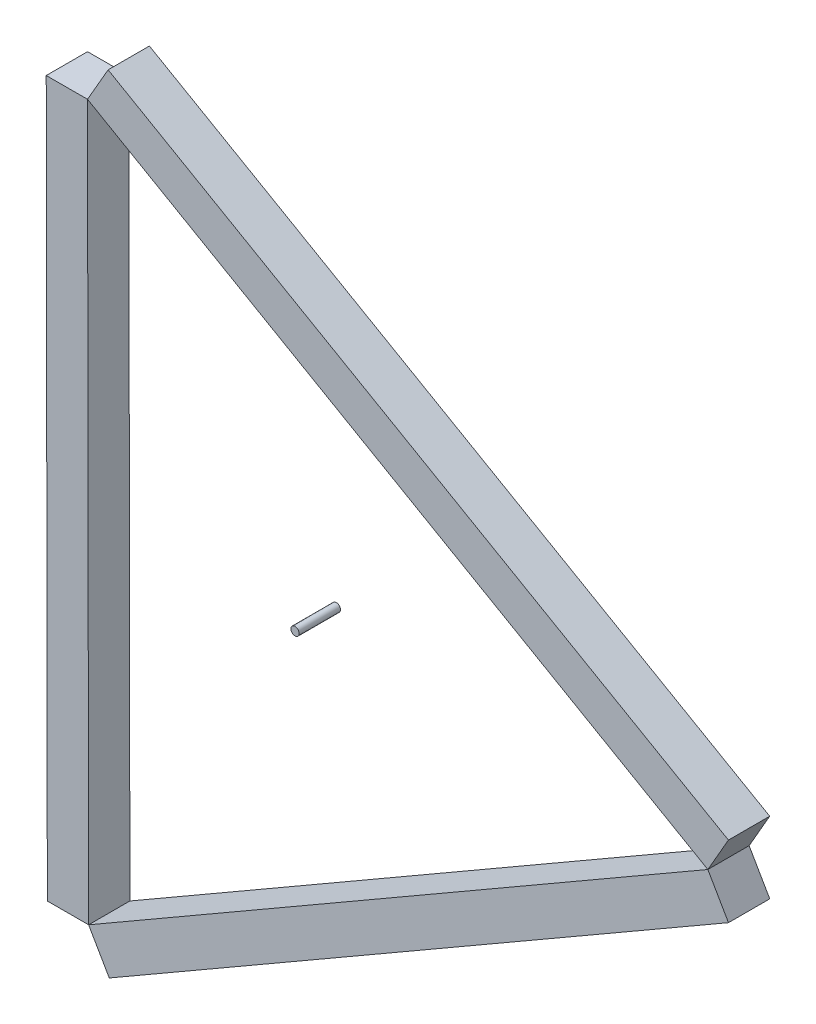
ISO-10303-21;
HEADER;
FILE_DESCRIPTION(('STEP AP214'),'2;1');
FILE_NAME('part.step','',(''),(''),'','','');
FILE_SCHEMA(('AUTOMOTIVE_DESIGN { 1 0 10303 214 1 1 1 1 }'));
ENDSEC;
DATA;
#1=APPLICATION_CONTEXT('core data for automotive mechanical design processes');
#2=APPLICATION_PROTOCOL_DEFINITION('international standard','automotive_design',2000,#1);
#3=PRODUCT_CONTEXT('',#1,'mechanical');
#4=PRODUCT('Part','Part','',(#3));
#5=PRODUCT_RELATED_PRODUCT_CATEGORY('part','',(#4));
#6=PRODUCT_DEFINITION_FORMATION('','',#4);
#7=PRODUCT_DEFINITION_CONTEXT('part definition',#1,'design');
#8=PRODUCT_DEFINITION('design','',#6,#7);
#9=PRODUCT_DEFINITION_SHAPE('','',#8);
#10=(LENGTH_UNIT() NAMED_UNIT(*) SI_UNIT(.MILLI.,.METRE.));
#11=(NAMED_UNIT(*) PLANE_ANGLE_UNIT() SI_UNIT($,.RADIAN.));
#12=(NAMED_UNIT(*) SI_UNIT($,.STERADIAN.) SOLID_ANGLE_UNIT());
#13=UNCERTAINTY_MEASURE_WITH_UNIT(LENGTH_MEASURE(1.E-05),#10,'distance_accuracy_value','');
#14=(GEOMETRIC_REPRESENTATION_CONTEXT(3) GLOBAL_UNCERTAINTY_ASSIGNED_CONTEXT((#13)) GLOBAL_UNIT_ASSIGNED_CONTEXT((#10,
#11,#12)) REPRESENTATION_CONTEXT('',''));
#15=CARTESIAN_POINT('',(0.,0.,0.));
#16=DIRECTION('',(0.,0.,1.));
#17=DIRECTION('',(1.,0.,0.));
#18=AXIS2_PLACEMENT_3D('',#15,#16,#17);
#19=CARTESIAN_POINT('',(0.,0.,50.));
#20=DIRECTION('',(0.,0.,-1.));
#21=DIRECTION('',(-1.,0.,0.));
#22=AXIS2_PLACEMENT_3D('',#19,#20,#21);
#23=CYLINDRICAL_SURFACE('',#22,10.);
#24=CARTESIAN_POINT('',(0.,0.,50.));
#25=DIRECTION('',(0.,0.,1.));
#26=DIRECTION('',(1.,0.,0.));
#27=AXIS2_PLACEMENT_3D('',#24,#25,#26);
#28=CIRCLE('',#27,10.);
#29=CARTESIAN_POINT('',(10.,0.,50.));
#30=VERTEX_POINT('',#29);
#31=EDGE_CURVE('E12',#30,#30,#28,.T.);
#32=ORIENTED_EDGE('',*,*,#31,.F.);
#33=EDGE_LOOP('',(#32));
#34=FACE_BOUND('',#33,.T.);
#35=CARTESIAN_POINT('',(0.,0.,-50.));
#36=DIRECTION('',(0.,0.,1.));
#37=DIRECTION('',(1.,0.,0.));
#38=AXIS2_PLACEMENT_3D('',#35,#36,#37);
#39=CIRCLE('',#38,10.);
#40=CARTESIAN_POINT('',(10.,0.,-50.));
#41=VERTEX_POINT('',#40);
#42=EDGE_CURVE('E101',#41,#41,#39,.T.);
#43=ORIENTED_EDGE('',*,*,#42,.T.);
#44=EDGE_LOOP('',(#43));
#45=FACE_BOUND('',#44,.T.);
#46=ADVANCED_FACE('F98',(#34,#45),#23,.T.);
#47=CARTESIAN_POINT('',(0.,0.,50.));
#48=DIRECTION('',(0.,0.,1.));
#49=DIRECTION('',(1.,0.,0.));
#50=AXIS2_PLACEMENT_3D('',#47,#48,#49);
#51=PLANE('',#50);
#52=ORIENTED_EDGE('',*,*,#31,.T.);
#53=EDGE_LOOP('',(#52));
#54=FACE_BOUND('',#53,.T.);
#55=ADVANCED_FACE('F113',(#54),#51,.T.);
#56=CARTESIAN_POINT('',(0.,0.,-50.));
#57=DIRECTION('',(0.,0.,1.));
#58=DIRECTION('',(1.,0.,0.));
#59=AXIS2_PLACEMENT_3D('',#56,#57,#58);
#60=PLANE('',#59);
#61=ORIENTED_EDGE('',*,*,#42,.F.);
#62=EDGE_LOOP('',(#61));
#63=FACE_BOUND('',#62,.T.);
#64=ADVANCED_FACE('F111',(#63),#60,.F.);
#65=CLOSED_SHELL('',(#46,#55,#64));
#66=MANIFOLD_SOLID_BREP('B2',#65);
#67=CARTESIAN_POINT('',(-501.3257187102,-0.768114748785728,50.));
#68=DIRECTION('',(-0.999998826234128,-0.00153216525410872,0.));
#69=DIRECTION('',(0.00153216525410872,-0.999998826234128,0.));
#70=AXIS2_PLACEMENT_3D('',#67,#68,#69);
#71=PLANE('',#70);
#72=DIRECTION('',(-0.00153216525410872,0.999998826234128,0.));
#73=VECTOR('',#72,1.);
#74=CARTESIAN_POINT('',(-501.3257187102,-0.768114748785728,-50.));
#75=LINE('',#74,#73);
#76=CARTESIAN_POINT('',(-499.999999999992,-866.025403784443,-50.));
#77=VERTEX_POINT('',#76);
#78=CARTESIAN_POINT('',(-502.651437420408,864.489174286872,-50.));
#79=VERTEX_POINT('',#78);
#80=EDGE_CURVE('E211',#77,#79,#75,.T.);
#81=ORIENTED_EDGE('',*,*,#80,.T.);
#82=DIRECTION('',(0.,0.,-1.));
#83=VECTOR('',#82,1.);
#84=CARTESIAN_POINT('',(-502.651437420408,864.489174286872,50.));
#85=LINE('',#84,#83);
#86=CARTESIAN_POINT('',(-502.651437420408,864.489174286872,50.));
#87=VERTEX_POINT('',#86);
#88=EDGE_CURVE('E96',#87,#79,#85,.T.);
#89=ORIENTED_EDGE('',*,*,#88,.F.);
#90=DIRECTION('',(-0.00153216525410872,0.999998826234128,0.));
#91=VECTOR('',#90,1.);
#92=CARTESIAN_POINT('',(-501.3257187102,-0.768114748785728,50.));
#93=LINE('',#92,#91);
#94=CARTESIAN_POINT('',(-499.999999999992,-866.025403784443,50.));
#95=VERTEX_POINT('',#94);
#96=EDGE_CURVE('E188',#95,#87,#93,.T.);
#97=ORIENTED_EDGE('',*,*,#96,.F.);
#98=DIRECTION('',(0.,0.,-1.));
#99=VECTOR('',#98,1.);
#100=CARTESIAN_POINT('',(-499.999999999992,-866.025403784443,50.));
#101=LINE('',#100,#99);
#102=EDGE_CURVE('E207',#95,#77,#101,.T.);
#103=ORIENTED_EDGE('',*,*,#102,.T.);
#104=EDGE_LOOP('',(#81,#89,#97,#103));
#105=FACE_BOUND('',#104,.T.);
#106=ADVANCED_FACE('F149',(#105),#71,.F.);
#107=CARTESIAN_POINT('',(-1.32571871020445,865.257289035656,50.));
#108=DIRECTION('',(-0.00153216525410449,0.999998826234128,0.));
#109=DIRECTION('',(-0.999998826234128,-0.00153216525410449,0.));
#110=AXIS2_PLACEMENT_3D('',#107,#108,#109);
#111=PLANE('',#110);
#112=DIRECTION('',(0.999998826234128,0.00153216525410449,0.));
#113=VECTOR('',#112,1.);
#114=CARTESIAN_POINT('',(-1.32571871020445,865.257289035656,-50.));
#115=LINE('',#114,#113);
#116=CARTESIAN_POINT('',(-602.651320043821,864.335957761462,-50.));
#117=VERTEX_POINT('',#116);
#118=EDGE_CURVE('E197',#117,#79,#115,.T.);
#119=ORIENTED_EDGE('',*,*,#118,.F.);
#120=DIRECTION('',(0.,0.,-1.));
#121=VECTOR('',#120,1.);
#122=CARTESIAN_POINT('',(-602.651320043821,864.335957761462,50.));
#123=LINE('',#122,#121);
#124=CARTESIAN_POINT('',(-602.651320043821,864.335957761462,50.));
#125=VERTEX_POINT('',#124);
#126=EDGE_CURVE('E157',#125,#117,#123,.T.);
#127=ORIENTED_EDGE('',*,*,#126,.F.);
#128=DIRECTION('',(0.999998826234128,0.00153216525410449,0.));
#129=VECTOR('',#128,1.);
#130=CARTESIAN_POINT('',(-1.32571871020445,865.257289035656,50.));
#131=LINE('',#130,#129);
#132=EDGE_CURVE('E195',#125,#87,#131,.T.);
#133=ORIENTED_EDGE('',*,*,#132,.T.);
#134=ORIENTED_EDGE('',*,*,#88,.T.);
#135=EDGE_LOOP('',(#119,#127,#133,#134));
#136=FACE_BOUND('',#135,.T.);
#137=ADVANCED_FACE('F194',(#136),#111,.T.);
#138=CARTESIAN_POINT('',(-601.325601333613,-0.921331274196619,50.));
#139=DIRECTION('',(-0.999998826234128,-0.00153216525410875,0.));
#140=DIRECTION('',(0.00153216525410875,-0.999998826234128,0.));
#141=AXIS2_PLACEMENT_3D('',#138,#139,#140);
#142=PLANE('',#141);
#143=DIRECTION('',(-0.00153216525410875,0.999998826234128,0.));
#144=VECTOR('',#143,1.);
#145=CARTESIAN_POINT('',(-601.325601333613,-0.921331274196619,-50.));
#146=LINE('',#145,#144);
#147=CARTESIAN_POINT('',(-599.999882623405,-866.178620309855,-50.));
#148=VERTEX_POINT('',#147);
#149=EDGE_CURVE('E215',#148,#117,#146,.T.);
#150=ORIENTED_EDGE('',*,*,#149,.F.);
#151=DIRECTION('',(0.,0.,-1.));
#152=VECTOR('',#151,1.);
#153=CARTESIAN_POINT('',(-599.999882623405,-866.178620309855,50.));
#154=LINE('',#153,#152);
#155=CARTESIAN_POINT('',(-599.999882623405,-866.178620309855,50.));
#156=VERTEX_POINT('',#155);
#157=EDGE_CURVE('E180',#156,#148,#154,.T.);
#158=ORIENTED_EDGE('',*,*,#157,.F.);
#159=DIRECTION('',(-0.00153216525410875,0.999998826234128,0.));
#160=VECTOR('',#159,1.);
#161=CARTESIAN_POINT('',(-601.325601333613,-0.921331274196619,50.));
#162=LINE('',#161,#160);
#163=EDGE_CURVE('E203',#156,#125,#162,.T.);
#164=ORIENTED_EDGE('',*,*,#163,.T.);
#165=ORIENTED_EDGE('',*,*,#126,.T.);
#166=EDGE_LOOP('',(#150,#158,#164,#165));
#167=FACE_BOUND('',#166,.T.);
#168=ADVANCED_FACE('F205',(#167),#142,.T.);
#169=CARTESIAN_POINT('',(1.3257187102083,-865.257289035658,50.));
#170=DIRECTION('',(-0.00153216525410893,0.999998826234128,0.));
#171=DIRECTION('',(-0.999998826234128,-0.00153216525410893,0.));
#172=AXIS2_PLACEMENT_3D('',#169,#170,#171);
#173=PLANE('',#172);
#174=DIRECTION('',(0.999998826234128,0.00153216525410893,0.));
#175=VECTOR('',#174,1.);
#176=CARTESIAN_POINT('',(1.3257187102083,-865.257289035658,-50.));
#177=LINE('',#176,#175);
#178=EDGE_CURVE('E183',#148,#77,#177,.T.);
#179=ORIENTED_EDGE('',*,*,#178,.T.);
#180=ORIENTED_EDGE('',*,*,#102,.F.);
#181=DIRECTION('',(0.999998826234128,0.00153216525410893,0.));
#182=VECTOR('',#181,1.);
#183=CARTESIAN_POINT('',(1.3257187102083,-865.257289035658,50.));
#184=LINE('',#183,#182);
#185=EDGE_CURVE('E165',#156,#95,#184,.T.);
#186=ORIENTED_EDGE('',*,*,#185,.F.);
#187=ORIENTED_EDGE('',*,*,#157,.T.);
#188=EDGE_LOOP('',(#179,#180,#186,#187));
#189=FACE_BOUND('',#188,.T.);
#190=ADVANCED_FACE('F228',(#189),#173,.F.);
#191=CARTESIAN_POINT('',(0.,0.,50.));
#192=DIRECTION('',(0.,0.,1.));
#193=DIRECTION('',(1.,0.,0.));
#194=AXIS2_PLACEMENT_3D('',#191,#192,#193);
#195=PLANE('',#194);
#196=ORIENTED_EDGE('',*,*,#96,.T.);
#197=ORIENTED_EDGE('',*,*,#132,.F.);
#198=ORIENTED_EDGE('',*,*,#163,.F.);
#199=ORIENTED_EDGE('',*,*,#185,.T.);
#200=EDGE_LOOP('',(#196,#197,#198,#199));
#201=FACE_BOUND('',#200,.T.);
#202=ADVANCED_FACE('F202',(#201),#195,.T.);
#203=CARTESIAN_POINT('',(0.,0.,-50.));
#204=DIRECTION('',(0.,0.,1.));
#205=DIRECTION('',(1.,0.,0.));
#206=AXIS2_PLACEMENT_3D('',#203,#204,#205);
#207=PLANE('',#206);
#208=ORIENTED_EDGE('',*,*,#80,.F.);
#209=ORIENTED_EDGE('',*,*,#178,.F.);
#210=ORIENTED_EDGE('',*,*,#149,.T.);
#211=ORIENTED_EDGE('',*,*,#118,.T.);
#212=EDGE_LOOP('',(#208,#209,#210,#211));
#213=FACE_BOUND('',#212,.T.);
#214=ADVANCED_FACE('F222',(#213),#207,.F.);
#215=CLOSED_SHELL('',(#106,#137,#168,#190,#202,#214));
#216=MANIFOLD_SOLID_BREP('B7',#215);
#217=CARTESIAN_POINT('',(250.000000000004,-433.012701892222,50.));
#218=DIRECTION('',(0.500000000000004,-0.866025403784436,0.));
#219=DIRECTION('',(0.866025403784436,0.500000000000004,0.));
#220=AXIS2_PLACEMENT_3D('',#217,#218,#219);
#221=PLANE('',#220);
#222=DIRECTION('',(-0.866025403784436,-0.500000000000004,0.));
#223=VECTOR('',#222,1.);
#224=CARTESIAN_POINT('',(250.000000000004,-433.012701892222,-50.));
#225=LINE('',#224,#223);
#226=CARTESIAN_POINT('',(1000.,0.,-50.));
#227=VERTEX_POINT('',#226);
#228=CARTESIAN_POINT('',(-499.999999999992,-866.025403784443,-50.));
#229=VERTEX_POINT('',#228);
#230=EDGE_CURVE('E369',#227,#229,#225,.T.);
#231=ORIENTED_EDGE('',*,*,#230,.T.);
#232=DIRECTION('',(0.,0.,-1.));
#233=VECTOR('',#232,1.);
#234=CARTESIAN_POINT('',(-499.999999999992,-866.025403784443,50.));
#235=LINE('',#234,#233);
#236=CARTESIAN_POINT('',(-499.999999999992,-866.025403784443,50.));
#237=VERTEX_POINT('',#236);
#238=EDGE_CURVE('E147',#237,#229,#235,.T.);
#239=ORIENTED_EDGE('',*,*,#238,.F.);
#240=DIRECTION('',(-0.866025403784436,-0.500000000000004,0.));
#241=VECTOR('',#240,1.);
#242=CARTESIAN_POINT('',(250.000000000004,-433.012701892222,50.));
#243=LINE('',#242,#241);
#244=CARTESIAN_POINT('',(1000.,0.,50.));
#245=VERTEX_POINT('',#244);
#246=EDGE_CURVE('E346',#245,#237,#243,.T.);
#247=ORIENTED_EDGE('',*,*,#246,.F.);
#248=DIRECTION('',(0.,0.,-1.));
#249=VECTOR('',#248,1.);
#250=CARTESIAN_POINT('',(1000.,0.,50.));
#251=LINE('',#250,#249);
#252=EDGE_CURVE('E322',#245,#227,#251,.T.);
#253=ORIENTED_EDGE('',*,*,#252,.T.);
#254=EDGE_LOOP('',(#231,#239,#247,#253));
#255=FACE_BOUND('',#254,.T.);
#256=ADVANCED_FACE('F306',(#255),#221,.F.);
#257=CARTESIAN_POINT('',(-749.999999999996,-433.012701892219,50.));
#258=DIRECTION('',(-0.866025403784437,-0.500000000000002,0.));
#259=DIRECTION('',(0.500000000000002,-0.866025403784437,0.));
#260=AXIS2_PLACEMENT_3D('',#257,#258,#259);
#261=PLANE('',#260);
#262=DIRECTION('',(-0.500000000000002,0.866025403784437,0.));
#263=VECTOR('',#262,1.);
#264=CARTESIAN_POINT('',(-749.999999999996,-433.012701892219,-50.));
#265=LINE('',#264,#263);
#266=CARTESIAN_POINT('',(-449.999999999992,-952.627944162887,-50.));
#267=VERTEX_POINT('',#266);
#268=EDGE_CURVE('E355',#267,#229,#265,.T.);
#269=ORIENTED_EDGE('',*,*,#268,.F.);
#270=DIRECTION('',(0.,0.,-1.));
#271=VECTOR('',#270,1.);
#272=CARTESIAN_POINT('',(-449.999999999992,-952.627944162887,50.));
#273=LINE('',#272,#271);
#274=CARTESIAN_POINT('',(-449.999999999992,-952.627944162887,50.));
#275=VERTEX_POINT('',#274);
#276=EDGE_CURVE('E314',#275,#267,#273,.T.);
#277=ORIENTED_EDGE('',*,*,#276,.F.);
#278=DIRECTION('',(-0.500000000000002,0.866025403784437,0.));
#279=VECTOR('',#278,1.);
#280=CARTESIAN_POINT('',(-749.999999999996,-433.012701892219,50.));
#281=LINE('',#280,#279);
#282=EDGE_CURVE('E353',#275,#237,#281,.T.);
#283=ORIENTED_EDGE('',*,*,#282,.T.);
#284=ORIENTED_EDGE('',*,*,#238,.T.);
#285=EDGE_LOOP('',(#269,#277,#283,#284));
#286=FACE_BOUND('',#285,.T.);
#287=ADVANCED_FACE('F352',(#286),#261,.T.);
#288=CARTESIAN_POINT('',(300.000000000005,-519.615242270665,50.));
#289=DIRECTION('',(0.500000000000004,-0.866025403784436,0.));
#290=DIRECTION('',(0.866025403784436,0.500000000000004,0.));
#291=AXIS2_PLACEMENT_3D('',#288,#289,#290);
#292=PLANE('',#291);
#293=DIRECTION('',(-0.866025403784436,-0.500000000000004,0.));
#294=VECTOR('',#293,1.);
#295=CARTESIAN_POINT('',(300.000000000005,-519.615242270665,-50.));
#296=LINE('',#295,#294);
#297=CARTESIAN_POINT('',(1050.,-86.6025403784436,-50.));
#298=VERTEX_POINT('',#297);
#299=EDGE_CURVE('E372',#298,#267,#296,.T.);
#300=ORIENTED_EDGE('',*,*,#299,.F.);
#301=DIRECTION('',(0.,0.,-1.));
#302=VECTOR('',#301,1.);
#303=CARTESIAN_POINT('',(1050.,-86.6025403784436,50.));
#304=LINE('',#303,#302);
#305=CARTESIAN_POINT('',(1050.,-86.6025403784436,50.));
#306=VERTEX_POINT('',#305);
#307=EDGE_CURVE('E335',#306,#298,#304,.T.);
#308=ORIENTED_EDGE('',*,*,#307,.F.);
#309=DIRECTION('',(-0.866025403784436,-0.500000000000004,0.));
#310=VECTOR('',#309,1.);
#311=CARTESIAN_POINT('',(300.000000000005,-519.615242270665,50.));
#312=LINE('',#311,#310);
#313=EDGE_CURVE('E361',#306,#275,#312,.T.);
#314=ORIENTED_EDGE('',*,*,#313,.T.);
#315=ORIENTED_EDGE('',*,*,#276,.T.);
#316=EDGE_LOOP('',(#300,#308,#314,#315));
#317=FACE_BOUND('',#316,.T.);
#318=ADVANCED_FACE('F363',(#317),#292,.T.);
#319=CARTESIAN_POINT('',(749.999999999995,433.012701892222,50.));
#320=DIRECTION('',(0.866025403784436,0.500000000000005,0.));
#321=DIRECTION('',(-0.500000000000005,0.866025403784436,0.));
#322=AXIS2_PLACEMENT_3D('',#319,#320,#321);
#323=PLANE('',#322);
#324=DIRECTION('',(0.500000000000005,-0.866025403784436,0.));
#325=VECTOR('',#324,1.);
#326=CARTESIAN_POINT('',(749.999999999995,433.012701892222,-50.));
#327=LINE('',#326,#325);
#328=EDGE_CURVE('E374',#227,#298,#327,.T.);
#329=ORIENTED_EDGE('',*,*,#328,.F.);
#330=ORIENTED_EDGE('',*,*,#252,.F.);
#331=DIRECTION('',(0.500000000000005,-0.866025403784436,0.));
#332=VECTOR('',#331,1.);
#333=CARTESIAN_POINT('',(749.999999999995,433.012701892222,50.));
#334=LINE('',#333,#332);
#335=EDGE_CURVE('E364',#245,#306,#334,.T.);
#336=ORIENTED_EDGE('',*,*,#335,.T.);
#337=ORIENTED_EDGE('',*,*,#307,.T.);
#338=EDGE_LOOP('',(#329,#330,#336,#337));
#339=FACE_BOUND('',#338,.T.);
#340=ADVANCED_FACE('F380',(#339),#323,.T.);
#341=CARTESIAN_POINT('',(0.,0.,50.));
#342=DIRECTION('',(0.,0.,1.));
#343=DIRECTION('',(1.,0.,0.));
#344=AXIS2_PLACEMENT_3D('',#341,#342,#343);
#345=PLANE('',#344);
#346=ORIENTED_EDGE('',*,*,#246,.T.);
#347=ORIENTED_EDGE('',*,*,#282,.F.);
#348=ORIENTED_EDGE('',*,*,#313,.F.);
#349=ORIENTED_EDGE('',*,*,#335,.F.);
#350=EDGE_LOOP('',(#346,#347,#348,#349));
#351=FACE_BOUND('',#350,.T.);
#352=ADVANCED_FACE('F360',(#351),#345,.T.);
#353=CARTESIAN_POINT('',(0.,0.,-50.));
#354=DIRECTION('',(0.,0.,1.));
#355=DIRECTION('',(1.,0.,0.));
#356=AXIS2_PLACEMENT_3D('',#353,#354,#355);
#357=PLANE('',#356);
#358=ORIENTED_EDGE('',*,*,#230,.F.);
#359=ORIENTED_EDGE('',*,*,#328,.T.);
#360=ORIENTED_EDGE('',*,*,#299,.T.);
#361=ORIENTED_EDGE('',*,*,#268,.T.);
#362=EDGE_LOOP('',(#358,#359,#360,#361));
#363=FACE_BOUND('',#362,.T.);
#364=ADVANCED_FACE('F379',(#363),#357,.F.);
#365=CLOSED_SHELL('',(#256,#287,#318,#340,#352,#364));
#366=MANIFOLD_SOLID_BREP('B90',#365);
#367=CARTESIAN_POINT('',(751.325718710203,-432.244587143437,50.));
#368=DIRECTION('',(0.866790469900427,-0.498672519084216,0.));
#369=DIRECTION('',(0.498672519084216,0.866790469900427,0.));
#370=AXIS2_PLACEMENT_3D('',#367,#368,#369);
#371=PLANE('',#370);
#372=DIRECTION('',(-0.498672519084216,-0.866790469900427,0.));
#373=VECTOR('',#372,1.);
#374=CARTESIAN_POINT('',(751.325718710203,-432.244587143437,-50.));
#375=LINE('',#374,#373);
#376=CARTESIAN_POINT('',(1049.86725190842,86.6790469900426,-50.));
#377=VERTEX_POINT('',#376);
#378=CARTESIAN_POINT('',(1000.,0.,-50.));
#379=VERTEX_POINT('',#378);
#380=EDGE_CURVE('E517',#377,#379,#375,.T.);
#381=ORIENTED_EDGE('',*,*,#380,.F.);
#382=DIRECTION('',(0.,0.,-1.));
#383=VECTOR('',#382,1.);
#384=CARTESIAN_POINT('',(1049.86725190842,86.6790469900426,50.));
#385=LINE('',#384,#383);
#386=CARTESIAN_POINT('',(1049.86725190842,86.6790469900426,50.));
#387=VERTEX_POINT('',#386);
#388=EDGE_CURVE('E304',#387,#377,#385,.T.);
#389=ORIENTED_EDGE('',*,*,#388,.F.);
#390=DIRECTION('',(-0.498672519084216,-0.866790469900427,0.));
#391=VECTOR('',#390,1.);
#392=CARTESIAN_POINT('',(751.325718710203,-432.244587143437,50.));
#393=LINE('',#392,#391);
#394=CARTESIAN_POINT('',(1000.,0.,50.));
#395=VERTEX_POINT('',#394);
#396=EDGE_CURVE('E511',#387,#395,#393,.T.);
#397=ORIENTED_EDGE('',*,*,#396,.T.);
#398=DIRECTION('',(0.,0.,-1.));
#399=VECTOR('',#398,1.);
#400=CARTESIAN_POINT('',(1000.,0.,50.));
#401=LINE('',#400,#399);
#402=EDGE_CURVE('E492',#395,#379,#401,.T.);
#403=ORIENTED_EDGE('',*,*,#402,.T.);
#404=EDGE_LOOP('',(#381,#389,#397,#403));
#405=FACE_BOUND('',#404,.T.);
#406=ADVANCED_FACE('F454',(#405),#371,.T.);
#407=CARTESIAN_POINT('',(298.541533198217,518.923634133479,50.));
#408=DIRECTION('',(0.498672519084214,0.866790469900428,0.));
#409=DIRECTION('',(-0.866790469900428,0.498672519084214,0.));
#410=AXIS2_PLACEMENT_3D('',#407,#408,#409);
#411=PLANE('',#410);
#412=DIRECTION('',(0.866790469900428,-0.498672519084214,0.));
#413=VECTOR('',#412,1.);
#414=CARTESIAN_POINT('',(298.541533198217,518.923634133479,-50.));
#415=LINE('',#414,#413);
#416=CARTESIAN_POINT('',(-452.784185511987,951.168221276915,-50.));
#417=VERTEX_POINT('',#416);
#418=EDGE_CURVE('E505',#417,#377,#415,.T.);
#419=ORIENTED_EDGE('',*,*,#418,.F.);
#420=DIRECTION('',(0.,0.,-1.));
#421=VECTOR('',#420,1.);
#422=CARTESIAN_POINT('',(-452.784185511987,951.168221276915,50.));
#423=LINE('',#422,#421);
#424=CARTESIAN_POINT('',(-452.784185511987,951.168221276915,50.));
#425=VERTEX_POINT('',#424);
#426=EDGE_CURVE('E462',#425,#417,#423,.T.);
#427=ORIENTED_EDGE('',*,*,#426,.F.);
#428=DIRECTION('',(0.866790469900428,-0.498672519084214,0.));
#429=VECTOR('',#428,1.);
#430=CARTESIAN_POINT('',(298.541533198217,518.923634133479,50.));
#431=LINE('',#430,#429);
#432=EDGE_CURVE('E503',#425,#387,#431,.T.);
#433=ORIENTED_EDGE('',*,*,#432,.T.);
#434=ORIENTED_EDGE('',*,*,#388,.T.);
#435=EDGE_LOOP('',(#419,#427,#433,#434));
#436=FACE_BOUND('',#435,.T.);
#437=ADVANCED_FACE('F501',(#436),#411,.T.);
#438=CARTESIAN_POINT('',(-751.325718710204,432.244587143436,50.));
#439=DIRECTION('',(0.866790469900428,-0.498672519084214,0.));
#440=DIRECTION('',(0.498672519084214,0.866790469900428,0.));
#441=AXIS2_PLACEMENT_3D('',#438,#439,#440);
#442=PLANE('',#441);
#443=DIRECTION('',(-0.498672519084214,-0.866790469900428,0.));
#444=VECTOR('',#443,1.);
#445=CARTESIAN_POINT('',(-751.325718710204,432.244587143436,-50.));
#446=LINE('',#445,#444);
#447=CARTESIAN_POINT('',(-502.651437420408,864.489174286872,-50.));
#448=VERTEX_POINT('',#447);
#449=EDGE_CURVE('E485',#417,#448,#446,.T.);
#450=ORIENTED_EDGE('',*,*,#449,.T.);
#451=DIRECTION('',(0.,0.,-1.));
#452=VECTOR('',#451,1.);
#453=CARTESIAN_POINT('',(-502.651437420408,864.489174286872,50.));
#454=LINE('',#453,#452);
#455=CARTESIAN_POINT('',(-502.651437420408,864.489174286872,50.));
#456=VERTEX_POINT('',#455);
#457=EDGE_CURVE('E506',#456,#448,#454,.T.);
#458=ORIENTED_EDGE('',*,*,#457,.F.);
#459=DIRECTION('',(-0.498672519084214,-0.866790469900428,0.));
#460=VECTOR('',#459,1.);
#461=CARTESIAN_POINT('',(-751.325718710204,432.244587143436,50.));
#462=LINE('',#461,#460);
#463=EDGE_CURVE('E507',#425,#456,#462,.T.);
#464=ORIENTED_EDGE('',*,*,#463,.F.);
#465=ORIENTED_EDGE('',*,*,#426,.T.);
#466=EDGE_LOOP('',(#450,#458,#464,#465));
#467=FACE_BOUND('',#466,.T.);
#468=ADVANCED_FACE('F508',(#467),#442,.F.);
#469=CARTESIAN_POINT('',(248.674281289796,432.244587143436,50.));
#470=DIRECTION('',(0.498672519084214,0.866790469900428,0.));
#471=DIRECTION('',(-0.866790469900428,0.498672519084214,0.));
#472=AXIS2_PLACEMENT_3D('',#469,#470,#471);
#473=PLANE('',#472);
#474=DIRECTION('',(0.866790469900428,-0.498672519084214,0.));
#475=VECTOR('',#474,1.);
#476=CARTESIAN_POINT('',(248.674281289796,432.244587143436,-50.));
#477=LINE('',#476,#475);
#478=EDGE_CURVE('E513',#448,#379,#477,.T.);
#479=ORIENTED_EDGE('',*,*,#478,.T.);
#480=ORIENTED_EDGE('',*,*,#402,.F.);
#481=DIRECTION('',(0.866790469900428,-0.498672519084214,0.));
#482=VECTOR('',#481,1.);
#483=CARTESIAN_POINT('',(248.674281289796,432.244587143436,50.));
#484=LINE('',#483,#482);
#485=EDGE_CURVE('E470',#456,#395,#484,.T.);
#486=ORIENTED_EDGE('',*,*,#485,.F.);
#487=ORIENTED_EDGE('',*,*,#457,.T.);
#488=EDGE_LOOP('',(#479,#480,#486,#487));
#489=FACE_BOUND('',#488,.T.);
#490=ADVANCED_FACE('F526',(#489),#473,.F.);
#491=CARTESIAN_POINT('',(0.,0.,50.));
#492=DIRECTION('',(0.,0.,1.));
#493=DIRECTION('',(1.,0.,0.));
#494=AXIS2_PLACEMENT_3D('',#491,#492,#493);
#495=PLANE('',#494);
#496=ORIENTED_EDGE('',*,*,#396,.F.);
#497=ORIENTED_EDGE('',*,*,#432,.F.);
#498=ORIENTED_EDGE('',*,*,#463,.T.);
#499=ORIENTED_EDGE('',*,*,#485,.T.);
#500=EDGE_LOOP('',(#496,#497,#498,#499));
#501=FACE_BOUND('',#500,.T.);
#502=ADVANCED_FACE('F510',(#501),#495,.T.);
#503=CARTESIAN_POINT('',(0.,0.,-50.));
#504=DIRECTION('',(0.,0.,1.));
#505=DIRECTION('',(1.,0.,0.));
#506=AXIS2_PLACEMENT_3D('',#503,#504,#505);
#507=PLANE('',#506);
#508=ORIENTED_EDGE('',*,*,#380,.T.);
#509=ORIENTED_EDGE('',*,*,#478,.F.);
#510=ORIENTED_EDGE('',*,*,#449,.F.);
#511=ORIENTED_EDGE('',*,*,#418,.T.);
#512=EDGE_LOOP('',(#508,#509,#510,#511));
#513=FACE_BOUND('',#512,.T.);
#514=ADVANCED_FACE('F528',(#513),#507,.F.);
#515=CLOSED_SHELL('',(#406,#437,#468,#490,#502,#514));
#516=MANIFOLD_SOLID_BREP('B141',#515);
#517=ADVANCED_BREP_SHAPE_REPRESENTATION('',(#18,#66,#216,#366,#516),#14);
#518=SHAPE_DEFINITION_REPRESENTATION(#9,#517);
ENDSEC;
END-ISO-10303-21;
